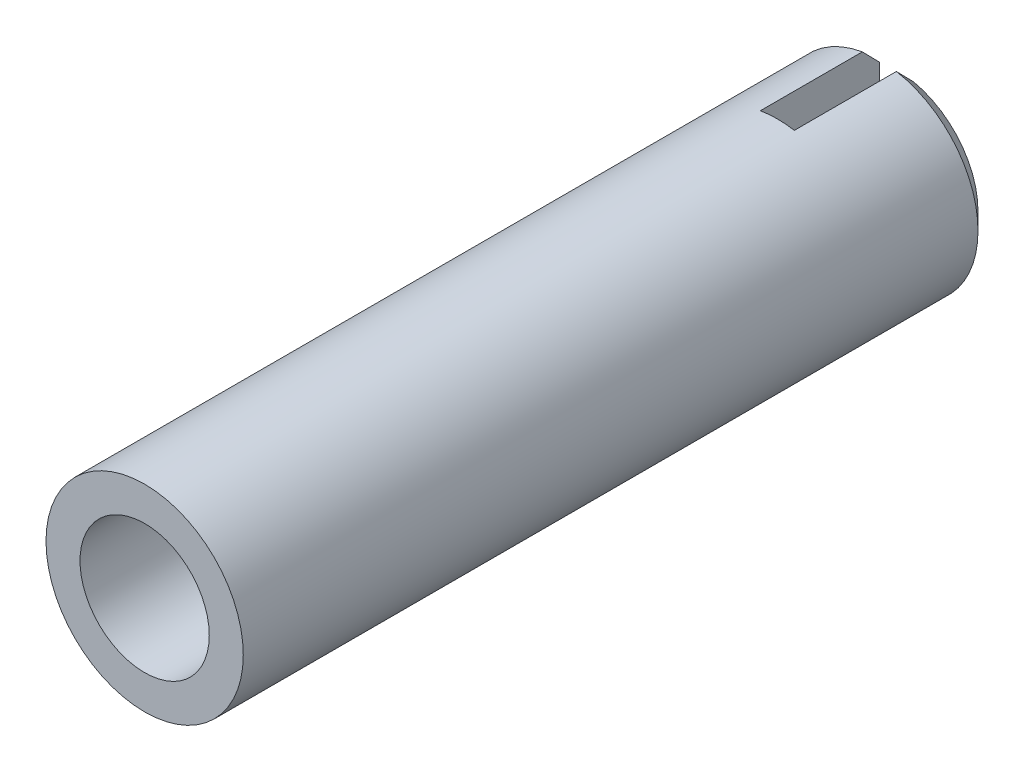
ISO-10303-21;
HEADER;
FILE_DESCRIPTION(('STEP AP214'),'2;1');
FILE_NAME('part.step','',(''),(''),'','','');
FILE_SCHEMA(('AUTOMOTIVE_DESIGN { 1 0 10303 214 1 1 1 1 }'));
ENDSEC;
DATA;
#1=APPLICATION_CONTEXT('core data for automotive mechanical design processes');
#2=APPLICATION_PROTOCOL_DEFINITION('international standard','automotive_design',2000,#1);
#3=PRODUCT_CONTEXT('',#1,'mechanical');
#4=PRODUCT('Part','Part','',(#3));
#5=PRODUCT_RELATED_PRODUCT_CATEGORY('part','',(#4));
#6=PRODUCT_DEFINITION_FORMATION('','',#4);
#7=PRODUCT_DEFINITION_CONTEXT('part definition',#1,'design');
#8=PRODUCT_DEFINITION('design','',#6,#7);
#9=PRODUCT_DEFINITION_SHAPE('','',#8);
#10=(LENGTH_UNIT() NAMED_UNIT(*) SI_UNIT(.MILLI.,.METRE.));
#11=(NAMED_UNIT(*) PLANE_ANGLE_UNIT() SI_UNIT($,.RADIAN.));
#12=(NAMED_UNIT(*) SI_UNIT($,.STERADIAN.) SOLID_ANGLE_UNIT());
#13=UNCERTAINTY_MEASURE_WITH_UNIT(LENGTH_MEASURE(1.E-05),#10,'distance_accuracy_value','');
#14=(GEOMETRIC_REPRESENTATION_CONTEXT(3) GLOBAL_UNCERTAINTY_ASSIGNED_CONTEXT((#13)) GLOBAL_UNIT_ASSIGNED_CONTEXT((#10,
#11,#12)) REPRESENTATION_CONTEXT('',''));
#15=CARTESIAN_POINT('',(0.,0.,0.));
#16=DIRECTION('',(0.,0.,1.));
#17=DIRECTION('',(1.,0.,0.));
#18=AXIS2_PLACEMENT_3D('',#15,#16,#17);
#19=CARTESIAN_POINT('',(0.,0.,-22.1));
#20=DIRECTION('',(0.,0.,1.));
#21=DIRECTION('',(1.,0.,0.));
#22=AXIS2_PLACEMENT_3D('',#19,#20,#21);
#23=PLANE('',#22);
#24=CARTESIAN_POINT('',(0.,0.,-22.1));
#25=DIRECTION('',(0.,0.,1.));
#26=DIRECTION('',(1.,0.,0.));
#27=AXIS2_PLACEMENT_3D('',#24,#25,#26);
#28=CIRCLE('',#27,1.9);
#29=CARTESIAN_POINT('',(0.50000000000001,-1.83303027798233,-22.1));
#30=VERTEX_POINT('',#29);
#31=CARTESIAN_POINT('',(0.500000000000011,1.83303027798233,-22.1));
#32=VERTEX_POINT('',#31);
#33=EDGE_CURVE('E207',#30,#32,#28,.T.);
#34=ORIENTED_EDGE('',*,*,#33,.T.);
#35=DIRECTION('',(0.,-1.,0.));
#36=VECTOR('',#35,1.);
#37=CARTESIAN_POINT('',(0.500000000000011,3.26536049666745,-22.1));
#38=LINE('',#37,#36);
#39=CARTESIAN_POINT('',(0.500000000000011,2.3473389188611,-22.1));
#40=VERTEX_POINT('',#39);
#41=EDGE_CURVE('E149',#40,#32,#38,.T.);
#42=ORIENTED_EDGE('',*,*,#41,.F.);
#43=CARTESIAN_POINT('',(0.,0.,-22.1));
#44=DIRECTION('',(0.,0.,1.));
#45=DIRECTION('',(1.,0.,0.));
#46=AXIS2_PLACEMENT_3D('',#43,#44,#45);
#47=CIRCLE('',#46,2.4);
#48=CARTESIAN_POINT('',(0.50000000000001,-2.3473389188611,-22.1));
#49=VERTEX_POINT('',#48);
#50=EDGE_CURVE('E151',#40,#49,#47,.F.);
#51=ORIENTED_EDGE('',*,*,#50,.T.);
#52=DIRECTION('',(0.,-1.,0.));
#53=VECTOR('',#52,1.);
#54=CARTESIAN_POINT('',(0.50000000000001,-3.26536049666745,-22.1));
#55=LINE('',#54,#53);
#56=EDGE_CURVE('E74',#30,#49,#55,.T.);
#57=ORIENTED_EDGE('',*,*,#56,.F.);
#58=EDGE_LOOP('',(#34,#42,#51,#57));
#59=FACE_BOUND('',#58,.T.);
#60=ADVANCED_FACE('F49',(#59),#23,.F.);
#61=CARTESIAN_POINT('',(0.,0.,-21.6));
#62=DIRECTION('',(0.,0.,1.));
#63=DIRECTION('',(1.,0.,0.));
#64=AXIS2_PLACEMENT_3D('',#61,#62,#63);
#65=CONICAL_SURFACE('',#64,2.9,0.785398163397458);
#66=CARTESIAN_POINT('',(0.500000000000011,4.56722580032637,-19.9054868036791));
#67=CARTESIAN_POINT('',(0.500000000000011,4.40086103835512,-20.0708535886335));
#68=CARTESIAN_POINT('',(0.500000000000011,4.23445195317437,-20.2361759196641));
#69=CARTESIAN_POINT('',(0.500000000000011,3.90149622107913,-20.5666506228982));
#70=CARTESIAN_POINT('',(0.500000000000011,3.73494958858814,-20.7318030096354));
#71=CARTESIAN_POINT('',(0.500000000000011,3.40168975670906,-21.0618372198682));
#72=CARTESIAN_POINT('',(0.500000000000011,3.23497662422342,-21.2267191109052));
#73=CARTESIAN_POINT('',(0.500000000000011,2.90119767581861,-21.5561565520699));
#74=CARTESIAN_POINT('',(0.500000000000011,2.73413182894792,-21.7207120708721));
#75=CARTESIAN_POINT('',(0.500000000000011,2.48305127699384,-21.967157203217));
#76=CARTESIAN_POINT('',(0.500000000000011,2.39925173843473,-22.04926596315));
#77=CARTESIAN_POINT('',(0.500000000000011,2.23145794918944,-22.2132798459408));
#78=CARTESIAN_POINT('',(0.500000000000011,2.14746370380979,-22.2951849742252));
#79=CARTESIAN_POINT('',(0.500000000000011,1.97922381124209,-22.4586932838065));
#80=CARTESIAN_POINT('',(0.500000000000011,1.8949782347399,-22.5402965377591));
#81=CARTESIAN_POINT('',(0.500000000000011,1.72608177565987,-22.7030991983488));
#82=CARTESIAN_POINT('',(0.500000000000011,1.64143085457795,-22.7842985650641));
#83=CARTESIAN_POINT('',(0.500000000000011,1.47145256519181,-22.9461382889178));
#84=CARTESIAN_POINT('',(0.500000000000011,1.38612466918012,-23.0267780939221));
#85=CARTESIAN_POINT('',(0.500000000000011,1.25739680638244,-23.1469241682626));
#86=CARTESIAN_POINT('',(0.500000000000011,1.21437136383943,-23.1868313237525));
#87=CARTESIAN_POINT('',(0.500000000000011,1.12798215259629,-23.2662843059874));
#88=CARTESIAN_POINT('',(0.500000000000011,1.08461836079116,-23.3058301076489));
#89=CARTESIAN_POINT('',(0.500000000000011,0.997385850604401,-23.3844639513819));
#90=CARTESIAN_POINT('',(0.500000000000011,0.953516608915167,-23.4235514147433));
#91=CARTESIAN_POINT('',(0.500000000000011,0.865145416125964,-23.5009892257541));
#92=CARTESIAN_POINT('',(0.500000000000011,0.820643586890463,-23.5393397121178));
#93=CARTESIAN_POINT('',(0.500000000000011,0.730658589761021,-23.6149792669702));
#94=CARTESIAN_POINT('',(0.500000000000011,0.685174456796516,-23.6522671995846));
#95=CARTESIAN_POINT('',(0.500000000000011,0.615859894005633,-23.7068532994026));
#96=CARTESIAN_POINT('',(0.500000000000011,0.592566000817788,-23.7248299151379));
#97=CARTESIAN_POINT('',(0.500000000000011,0.545511044110777,-23.7601719461194));
#98=CARTESIAN_POINT('',(0.500000000000011,0.521749865788445,-23.7775372081682));
#99=CARTESIAN_POINT('',(0.500000000000011,0.497706369424147,-23.7945131963209));
#100=B_SPLINE_CURVE_WITH_KNOTS('',3,(#66,#67,#68,#69,#70,#71,#72,#73,#74,#75,#76,#77,#78,#79,
#80,#81,#82,#83,#84,#85,#86,#87,#88,#89,#90,#91,#92,#93,#94,#95,#96,#97,#98,#99),.UNSPECIFIED.,
.F.,.F.,(4,2,2,2,2,2,2,2,2,2,2,2,2,2,2,2,4),(0.,0.703712208710922,1.40735817552992,
2.11078794100939,2.81428223793532,3.16624491926415,3.51819811844304,3.87006023531966,
4.22195646659375,4.57416102479055,4.75021044937648,4.92627200302129,5.10253602339399,
5.27876653568803,5.45517886330469,5.54344165659892,5.63172641221677),.UNSPECIFIED.);
#101=CARTESIAN_POINT('',(0.500000000000011,2.85657137141714,-21.6));
#102=VERTEX_POINT('',#101);
#103=EDGE_CURVE('E269',#102,#40,#100,.T.);
#104=ORIENTED_EDGE('',*,*,#103,.F.);
#105=CARTESIAN_POINT('',(0.,0.,-21.6));
#106=DIRECTION('',(0.,0.,1.));
#107=DIRECTION('',(1.,0.,0.));
#108=AXIS2_PLACEMENT_3D('',#105,#106,#107);
#109=CIRCLE('',#108,2.9);
#110=CARTESIAN_POINT('',(0.50000000000001,-2.85657137141714,-21.6));
#111=VERTEX_POINT('',#110);
#112=EDGE_CURVE('E157',#111,#102,#109,.T.);
#113=ORIENTED_EDGE('',*,*,#112,.F.);
#114=CARTESIAN_POINT('',(0.50000000000001,-0.497706369424139,-23.7945131963209));
#115=CARTESIAN_POINT('',(0.50000000000001,-0.52599163831723,-23.7745304111347));
#116=CARTESIAN_POINT('',(0.50000000000001,-0.553893059040027,-23.7540211707483));
#117=CARTESIAN_POINT('',(0.50000000000001,-0.609072205970474,-23.7121965079509));
#118=CARTESIAN_POINT('',(0.50000000000001,-0.636350135416068,-23.6908813544326));
#119=CARTESIAN_POINT('',(0.50000000000001,-0.690422117616199,-23.6476961811669));
#120=CARTESIAN_POINT('',(0.50000000000001,-0.717216557136705,-23.6258266419495));
#121=CARTESIAN_POINT('',(0.50000000000001,-0.770445986917643,-23.581650040367));
#122=CARTESIAN_POINT('',(0.50000000000001,-0.79688094262483,-23.5593429364398));
#123=CARTESIAN_POINT('',(0.50000000000001,-0.875707583654898,-23.4919751931768));
#124=CARTESIAN_POINT('',(0.50000000000001,-0.927677710608251,-23.4464220967916));
#125=CARTESIAN_POINT('',(0.50000000000001,-1.0308970454738,-23.3544837554955));
#126=CARTESIAN_POINT('',(0.50000000000001,-1.08214605136239,-23.3080982853603));
#127=CARTESIAN_POINT('',(0.50000000000001,-1.23477610455249,-23.1684750501359));
#128=CARTESIAN_POINT('',(0.50000000000001,-1.33542228703691,-23.0744354829964));
#129=CARTESIAN_POINT('',(0.50000000000001,-1.53569819522848,-22.8852795267836));
#130=CARTESIAN_POINT('',(0.50000000000001,-1.63532787326572,-22.7901630876468));
#131=CARTESIAN_POINT('',(0.50000000000001,-1.83397039306146,-22.5992925682383));
#132=CARTESIAN_POINT('',(0.50000000000001,-1.93298324804286,-22.5035385017271));
#133=CARTESIAN_POINT('',(0.50000000000001,-2.13061415393263,-22.3116289036643));
#134=CARTESIAN_POINT('',(0.50000000000001,-2.22923221341645,-22.2154733809265));
#135=CARTESIAN_POINT('',(0.50000000000001,-2.52493713991544,-21.9263718552832));
#136=CARTESIAN_POINT('',(0.50000000000001,-2.72163230272518,-21.7330253818188));
#137=CARTESIAN_POINT('',(0.50000000000001,-3.11448812378032,-21.3458006105996));
#138=CARTESIAN_POINT('',(0.50000000000001,-3.31064879458856,-21.1519223255635));
#139=CARTESIAN_POINT('',(0.50000000000001,-3.59517050732349,-20.8702482583632));
#140=CARTESIAN_POINT('',(0.50000000000001,-3.68365855062585,-20.7825807621648));
#141=CARTESIAN_POINT('',(0.50000000000001,-3.86058191562407,-20.6071916320026));
#142=CARTESIAN_POINT('',(0.50000000000001,-3.94901723703092,-20.5194699977474));
#143=CARTESIAN_POINT('',(0.50000000000001,-4.1257687972236,-20.3440584390401));
#144=CARTESIAN_POINT('',(0.50000000000001,-4.2140850730837,-20.2563685519429));
#145=CARTESIAN_POINT('',(0.50000000000001,-4.39068101051773,-20.0809529157863));
#146=CARTESIAN_POINT('',(0.50000000000001,-4.47896067229609,-19.9932271669326));
#147=CARTESIAN_POINT('',(0.50000000000001,-4.56722580032637,-19.9054868036791));
#148=B_SPLINE_CURVE_WITH_KNOTS('',3,(#114,#115,#116,#117,#118,#119,#120,#121,#122,#123,#124,
#125,#126,#127,#128,#129,#130,#131,#132,#133,#134,#135,#136,#137,#138,#139,#140,#141,#142,#143,
#144,#145,#146,#147),.UNSPECIFIED.,.F.,.F.,(4,2,2,2,2,2,2,2,2,2,2,2,2,2,2,2,4),(0.,
0.103875631204322,0.207716904981804,0.311471057131955,0.415235112529648,0.622544286590499,
0.829910426588166,1.2431186523347,1.65634616760963,2.06956479379518,2.48277439511077,
3.3102054632717,4.13761691254397,4.51130326531437,4.88499164797406,5.25835945516548,
5.63172514887428),.UNSPECIFIED.);
#149=EDGE_CURVE('E140',#49,#111,#148,.T.);
#150=ORIENTED_EDGE('',*,*,#149,.F.);
#151=ORIENTED_EDGE('',*,*,#50,.F.);
#152=EDGE_LOOP('',(#104,#113,#150,#151));
#153=FACE_BOUND('',#152,.T.);
#154=ADVANCED_FACE('F192',(#153),#65,.T.);
#155=CARTESIAN_POINT('',(0.,0.,-22.1));
#156=DIRECTION('',(0.,0.,1.));
#157=DIRECTION('',(1.,0.,0.));
#158=AXIS2_PLACEMENT_3D('',#155,#156,#157);
#159=CYLINDRICAL_SURFACE('',#158,2.9);
#160=DIRECTION('',(0.,0.,1.));
#161=VECTOR('',#160,1.);
#162=CARTESIAN_POINT('',(0.500000000000011,2.85657137141714,-22.1));
#163=LINE('',#162,#161);
#164=CARTESIAN_POINT('',(0.500000000000011,2.85657137141714,-18.6));
#165=VERTEX_POINT('',#164);
#166=EDGE_CURVE('E235',#165,#102,#163,.F.);
#167=ORIENTED_EDGE('',*,*,#166,.F.);
#168=CARTESIAN_POINT('',(0.,0.,-18.6));
#169=DIRECTION('',(0.,0.,1.));
#170=DIRECTION('',(1.,0.,0.));
#171=AXIS2_PLACEMENT_3D('',#168,#169,#170);
#172=CIRCLE('',#171,2.9);
#173=CARTESIAN_POINT('',(-0.499999999999989,2.85657137141714,-18.6));
#174=VERTEX_POINT('',#173);
#175=EDGE_CURVE('E215',#174,#165,#172,.F.);
#176=ORIENTED_EDGE('',*,*,#175,.F.);
#177=DIRECTION('',(0.,0.,1.));
#178=VECTOR('',#177,1.);
#179=CARTESIAN_POINT('',(-0.499999999999989,2.85657137141714,-22.1));
#180=LINE('',#179,#178);
#181=CARTESIAN_POINT('',(-0.499999999999989,2.85657137141714,-21.6));
#182=VERTEX_POINT('',#181);
#183=EDGE_CURVE('E228',#182,#174,#180,.T.);
#184=ORIENTED_EDGE('',*,*,#183,.F.);
#185=CARTESIAN_POINT('',(-0.49999999999999,-2.85657137141714,-21.6));
#186=VERTEX_POINT('',#185);
#187=EDGE_CURVE('E155',#182,#186,#109,.T.);
#188=ORIENTED_EDGE('',*,*,#187,.T.);
#189=DIRECTION('',(0.,0.,1.));
#190=VECTOR('',#189,1.);
#191=CARTESIAN_POINT('',(-0.49999999999999,-2.85657137141714,-22.1));
#192=LINE('',#191,#190);
#193=CARTESIAN_POINT('',(-0.49999999999999,-2.85657137141714,-18.6));
#194=VERTEX_POINT('',#193);
#195=EDGE_CURVE('E134',#194,#186,#192,.F.);
#196=ORIENTED_EDGE('',*,*,#195,.F.);
#197=CARTESIAN_POINT('',(0.,0.,-18.6));
#198=DIRECTION('',(0.,0.,-1.));
#199=DIRECTION('',(-1.,0.,0.));
#200=AXIS2_PLACEMENT_3D('',#197,#198,#199);
#201=CIRCLE('',#200,2.9);
#202=CARTESIAN_POINT('',(0.50000000000001,-2.85657137141714,-18.6));
#203=VERTEX_POINT('',#202);
#204=EDGE_CURVE('E242',#194,#203,#201,.F.);
#205=ORIENTED_EDGE('',*,*,#204,.T.);
#206=DIRECTION('',(0.,0.,1.));
#207=VECTOR('',#206,1.);
#208=CARTESIAN_POINT('',(0.50000000000001,-2.85657137141714,-22.1));
#209=LINE('',#208,#207);
#210=EDGE_CURVE('E252',#111,#203,#209,.T.);
#211=ORIENTED_EDGE('',*,*,#210,.F.);
#212=ORIENTED_EDGE('',*,*,#112,.T.);
#213=EDGE_LOOP('',(#167,#176,#184,#188,#196,#205,#211,#212));
#214=FACE_BOUND('',#213,.T.);
#215=CARTESIAN_POINT('',(0.,0.,0.));
#216=DIRECTION('',(0.,0.,1.));
#217=DIRECTION('',(1.,0.,0.));
#218=AXIS2_PLACEMENT_3D('',#215,#216,#217);
#219=CIRCLE('',#218,2.9);
#220=CARTESIAN_POINT('',(2.9,0.,0.));
#221=VERTEX_POINT('',#220);
#222=EDGE_CURVE('E213',#221,#221,#219,.T.);
#223=ORIENTED_EDGE('',*,*,#222,.F.);
#224=EDGE_LOOP('',(#223));
#225=FACE_BOUND('',#224,.T.);
#226=ADVANCED_FACE('F188',(#214,#225),#159,.T.);
#227=CARTESIAN_POINT('',(-0.49999999999999,-2.3473389188611,-22.1));
#228=VERTEX_POINT('',#227);
#229=CARTESIAN_POINT('',(-0.499999999999989,2.3473389188611,-22.1));
#230=VERTEX_POINT('',#229);
#231=EDGE_CURVE('E146',#228,#230,#47,.F.);
#232=ORIENTED_EDGE('',*,*,#231,.T.);
#233=DIRECTION('',(0.,1.,0.));
#234=VECTOR('',#233,1.);
#235=CARTESIAN_POINT('',(-0.499999999999989,3.26536049666745,-22.1));
#236=LINE('',#235,#234);
#237=CARTESIAN_POINT('',(-0.499999999999989,1.83303027798234,-22.1));
#238=VERTEX_POINT('',#237);
#239=EDGE_CURVE('E66',#238,#230,#236,.T.);
#240=ORIENTED_EDGE('',*,*,#239,.F.);
#241=CARTESIAN_POINT('',(-0.49999999999999,-1.83303027798234,-22.1));
#242=VERTEX_POINT('',#241);
#243=EDGE_CURVE('E148',#238,#242,#28,.T.);
#244=ORIENTED_EDGE('',*,*,#243,.T.);
#245=DIRECTION('',(0.,1.,0.));
#246=VECTOR('',#245,1.);
#247=CARTESIAN_POINT('',(-0.49999999999999,-3.26536049666745,-22.1));
#248=LINE('',#247,#246);
#249=EDGE_CURVE('E131',#228,#242,#248,.T.);
#250=ORIENTED_EDGE('',*,*,#249,.F.);
#251=EDGE_LOOP('',(#232,#240,#244,#250));
#252=FACE_BOUND('',#251,.T.);
#253=ADVANCED_FACE('F145',(#252),#23,.F.);
#254=CARTESIAN_POINT('',(0.,0.,0.));
#255=DIRECTION('',(0.,0.,1.));
#256=DIRECTION('',(1.,0.,0.));
#257=AXIS2_PLACEMENT_3D('',#254,#255,#256);
#258=PLANE('',#257);
#259=CARTESIAN_POINT('',(0.,0.,0.));
#260=DIRECTION('',(0.,0.,1.));
#261=DIRECTION('',(1.,0.,0.));
#262=AXIS2_PLACEMENT_3D('',#259,#260,#261);
#263=CIRCLE('',#262,1.9);
#264=CARTESIAN_POINT('',(1.9,0.,0.));
#265=VERTEX_POINT('',#264);
#266=EDGE_CURVE('E211',#265,#265,#263,.T.);
#267=ORIENTED_EDGE('',*,*,#266,.F.);
#268=EDGE_LOOP('',(#267));
#269=FACE_BOUND('',#268,.T.);
#270=ORIENTED_EDGE('',*,*,#222,.T.);
#271=EDGE_LOOP('',(#270));
#272=FACE_BOUND('',#271,.T.);
#273=ADVANCED_FACE('F184',(#269,#272),#258,.T.);
#274=CARTESIAN_POINT('',(0.,0.,-22.1));
#275=DIRECTION('',(0.,0.,1.));
#276=DIRECTION('',(1.,0.,0.));
#277=AXIS2_PLACEMENT_3D('',#274,#275,#276);
#278=CYLINDRICAL_SURFACE('',#277,1.9);
#279=CARTESIAN_POINT('',(0.,0.,-18.6));
#280=DIRECTION('',(0.,0.,1.));
#281=DIRECTION('',(1.,0.,0.));
#282=AXIS2_PLACEMENT_3D('',#279,#280,#281);
#283=CIRCLE('',#282,1.9);
#284=CARTESIAN_POINT('',(-0.499999999999989,1.83303027798234,-18.6));
#285=VERTEX_POINT('',#284);
#286=CARTESIAN_POINT('',(0.500000000000011,1.83303027798233,-18.6));
#287=VERTEX_POINT('',#286);
#288=EDGE_CURVE('E12',#285,#287,#283,.F.);
#289=ORIENTED_EDGE('',*,*,#288,.T.);
#290=DIRECTION('',(0.,0.,1.));
#291=VECTOR('',#290,1.);
#292=CARTESIAN_POINT('',(0.500000000000011,1.83303027798233,-22.1));
#293=LINE('',#292,#291);
#294=EDGE_CURVE('E241',#287,#32,#293,.F.);
#295=ORIENTED_EDGE('',*,*,#294,.T.);
#296=ORIENTED_EDGE('',*,*,#33,.F.);
#297=DIRECTION('',(0.,0.,1.));
#298=VECTOR('',#297,1.);
#299=CARTESIAN_POINT('',(0.50000000000001,-1.83303027798233,-22.1));
#300=LINE('',#299,#298);
#301=CARTESIAN_POINT('',(0.50000000000001,-1.83303027798233,-18.6));
#302=VERTEX_POINT('',#301);
#303=EDGE_CURVE('E265',#30,#302,#300,.T.);
#304=ORIENTED_EDGE('',*,*,#303,.T.);
#305=CARTESIAN_POINT('',(0.,0.,-18.6));
#306=DIRECTION('',(0.,0.,-1.));
#307=DIRECTION('',(-1.,0.,0.));
#308=AXIS2_PLACEMENT_3D('',#305,#306,#307);
#309=CIRCLE('',#308,1.9);
#310=CARTESIAN_POINT('',(-0.49999999999999,-1.83303027798234,-18.6));
#311=VERTEX_POINT('',#310);
#312=EDGE_CURVE('E59',#311,#302,#309,.F.);
#313=ORIENTED_EDGE('',*,*,#312,.F.);
#314=DIRECTION('',(0.,0.,1.));
#315=VECTOR('',#314,1.);
#316=CARTESIAN_POINT('',(-0.49999999999999,-1.83303027798234,-22.1));
#317=LINE('',#316,#315);
#318=EDGE_CURVE('E232',#311,#242,#317,.F.);
#319=ORIENTED_EDGE('',*,*,#318,.T.);
#320=ORIENTED_EDGE('',*,*,#243,.F.);
#321=DIRECTION('',(0.,0.,1.));
#322=VECTOR('',#321,1.);
#323=CARTESIAN_POINT('',(-0.499999999999989,1.83303027798234,-22.1));
#324=LINE('',#323,#322);
#325=EDGE_CURVE('E231',#238,#285,#324,.T.);
#326=ORIENTED_EDGE('',*,*,#325,.T.);
#327=EDGE_LOOP('',(#289,#295,#296,#304,#313,#319,#320,#326));
#328=FACE_BOUND('',#327,.T.);
#329=ORIENTED_EDGE('',*,*,#266,.T.);
#330=EDGE_LOOP('',(#329));
#331=FACE_BOUND('',#330,.T.);
#332=ADVANCED_FACE('F181',(#328,#331),#278,.F.);
#333=CARTESIAN_POINT('',(-0.49999999999999,0.497706369424167,-23.7945131963209));
#334=CARTESIAN_POINT('',(-0.49999999999999,0.525991638317258,-23.7745304111347));
#335=CARTESIAN_POINT('',(-0.49999999999999,0.553893059040054,-23.7540211707483));
#336=CARTESIAN_POINT('',(-0.49999999999999,0.609072205970501,-23.7121965079509));
#337=CARTESIAN_POINT('',(-0.49999999999999,0.636350135416095,-23.6908813544326));
#338=CARTESIAN_POINT('',(-0.49999999999999,0.690422117616225,-23.6476961811669));
#339=CARTESIAN_POINT('',(-0.49999999999999,0.71721655713673,-23.6258266419495));
#340=CARTESIAN_POINT('',(-0.49999999999999,0.770445986917668,-23.581650040367));
#341=CARTESIAN_POINT('',(-0.49999999999999,0.796880942624856,-23.5593429364398));
#342=CARTESIAN_POINT('',(-0.49999999999999,0.875707583654923,-23.4919751931768));
#343=CARTESIAN_POINT('',(-0.499999999999989,0.927677710608276,-23.4464220967916));
#344=CARTESIAN_POINT('',(-0.499999999999989,1.03089704547382,-23.3544837554954));
#345=CARTESIAN_POINT('',(-0.499999999999989,1.08214605136242,-23.3080982853603));
#346=CARTESIAN_POINT('',(-0.499999999999989,1.23477610455252,-23.1684750501359));
#347=CARTESIAN_POINT('',(-0.499999999999989,1.33542228703693,-23.0744354829964));
#348=CARTESIAN_POINT('',(-0.499999999999989,1.53569819522851,-22.8852795267836));
#349=CARTESIAN_POINT('',(-0.499999999999989,1.63532787326575,-22.7901630876468));
#350=CARTESIAN_POINT('',(-0.499999999999989,1.8339703930615,-22.5992925682382));
#351=CARTESIAN_POINT('',(-0.499999999999989,1.9329832480429,-22.5035385017271));
#352=CARTESIAN_POINT('',(-0.499999999999989,2.13061415393266,-22.3116289036643));
#353=CARTESIAN_POINT('',(-0.499999999999989,2.22923221341649,-22.2154733809265));
#354=CARTESIAN_POINT('',(-0.499999999999989,2.52493713991548,-21.9263718552832));
#355=CARTESIAN_POINT('',(-0.499999999999989,2.72163230272522,-21.7330253818187));
#356=CARTESIAN_POINT('',(-0.499999999999989,3.11448812378036,-21.3458006105996));
#357=CARTESIAN_POINT('',(-0.499999999999989,3.31064879458861,-21.1519223255635));
#358=CARTESIAN_POINT('',(-0.499999999999989,3.59517050732353,-20.8702482583632));
#359=CARTESIAN_POINT('',(-0.499999999999989,3.68365855062589,-20.7825807621647));
#360=CARTESIAN_POINT('',(-0.499999999999989,3.8605819156241,-20.6071916320026));
#361=CARTESIAN_POINT('',(-0.499999999999989,3.94901723703095,-20.5194699977473));
#362=CARTESIAN_POINT('',(-0.499999999999989,4.12576879722362,-20.3440584390401));
#363=CARTESIAN_POINT('',(-0.499999999999989,4.21408507308372,-20.2563685519429));
#364=CARTESIAN_POINT('',(-0.499999999999989,4.39068101051774,-20.0809529157863));
#365=CARTESIAN_POINT('',(-0.499999999999989,4.4789606722961,-19.9932271669326));
#366=CARTESIAN_POINT('',(-0.499999999999989,4.56722580032637,-19.9054868036791));
#367=B_SPLINE_CURVE_WITH_KNOTS('',3,(#333,#334,#335,#336,#337,#338,#339,#340,#341,#342,#343,
#344,#345,#346,#347,#348,#349,#350,#351,#352,#353,#354,#355,#356,#357,#358,#359,#360,#361,#362,
#363,#364,#365,#366),.UNSPECIFIED.,.F.,.F.,(4,2,2,2,2,2,2,2,2,2,2,2,2,2,2,2,4),(0.,
0.103875631204321,0.207716904981805,0.311471057131955,0.415235112529649,0.622544286590498,
0.829910426588173,1.2431186523347,1.65634616760964,2.0695647937952,2.48277439511079,
3.31020546327173,4.13761691254401,4.5113032653144,4.88499164797406,5.25835945516547,
5.63172514887426),.UNSPECIFIED.);
#368=EDGE_CURVE('E139',#230,#182,#367,.T.);
#369=ORIENTED_EDGE('',*,*,#368,.F.);
#370=ORIENTED_EDGE('',*,*,#231,.F.);
#371=CARTESIAN_POINT('',(-0.49999999999999,-4.56722580032637,-19.9054868036791));
#372=CARTESIAN_POINT('',(-0.49999999999999,-4.40086103835513,-20.0708535886335));
#373=CARTESIAN_POINT('',(-0.49999999999999,-4.23445195317438,-20.2361759196641));
#374=CARTESIAN_POINT('',(-0.49999999999999,-3.90149622107914,-20.5666506228982));
#375=CARTESIAN_POINT('',(-0.49999999999999,-3.73494958858815,-20.7318030096354));
#376=CARTESIAN_POINT('',(-0.49999999999999,-3.40168975670907,-21.0618372198682));
#377=CARTESIAN_POINT('',(-0.49999999999999,-3.23497662422343,-21.2267191109052));
#378=CARTESIAN_POINT('',(-0.49999999999999,-2.90119767581862,-21.5561565520699));
#379=CARTESIAN_POINT('',(-0.49999999999999,-2.73413182894793,-21.7207120708721));
#380=CARTESIAN_POINT('',(-0.49999999999999,-2.48305127699385,-21.967157203217));
#381=CARTESIAN_POINT('',(-0.49999999999999,-2.39925173843474,-22.04926596315));
#382=CARTESIAN_POINT('',(-0.49999999999999,-2.23145794918946,-22.2132798459408));
#383=CARTESIAN_POINT('',(-0.49999999999999,-2.1474637038098,-22.2951849742252));
#384=CARTESIAN_POINT('',(-0.49999999999999,-1.97922381124211,-22.4586932838064));
#385=CARTESIAN_POINT('',(-0.49999999999999,-1.89497823473991,-22.5402965377591));
#386=CARTESIAN_POINT('',(-0.49999999999999,-1.72608177565988,-22.7030991983487));
#387=CARTESIAN_POINT('',(-0.49999999999999,-1.64143085457797,-22.7842985650641));
#388=CARTESIAN_POINT('',(-0.49999999999999,-1.47145256519183,-22.9461382889178));
#389=CARTESIAN_POINT('',(-0.49999999999999,-1.38612466918014,-23.0267780939221));
#390=CARTESIAN_POINT('',(-0.49999999999999,-1.25739680638246,-23.1469241682626));
#391=CARTESIAN_POINT('',(-0.49999999999999,-1.21437136383944,-23.1868313237525));
#392=CARTESIAN_POINT('',(-0.49999999999999,-1.12798215259631,-23.2662843059874));
#393=CARTESIAN_POINT('',(-0.49999999999999,-1.08461836079118,-23.3058301076489));
#394=CARTESIAN_POINT('',(-0.49999999999999,-0.997385850604421,-23.3844639513819));
#395=CARTESIAN_POINT('',(-0.49999999999999,-0.953516608915187,-23.4235514147433));
#396=CARTESIAN_POINT('',(-0.49999999999999,-0.865145416125984,-23.500989225754));
#397=CARTESIAN_POINT('',(-0.49999999999999,-0.820643586890484,-23.5393397121178));
#398=CARTESIAN_POINT('',(-0.49999999999999,-0.730658589761044,-23.6149792669702));
#399=CARTESIAN_POINT('',(-0.49999999999999,-0.68517445679654,-23.6522671995846));
#400=CARTESIAN_POINT('',(-0.49999999999999,-0.615859894005659,-23.7068532994026));
#401=CARTESIAN_POINT('',(-0.49999999999999,-0.592566000817814,-23.7248299151379));
#402=CARTESIAN_POINT('',(-0.49999999999999,-0.545511044110805,-23.7601719461194));
#403=CARTESIAN_POINT('',(-0.49999999999999,-0.521749865788474,-23.7775372081682));
#404=CARTESIAN_POINT('',(-0.49999999999999,-0.497706369424177,-23.7945131963209));
#405=B_SPLINE_CURVE_WITH_KNOTS('',3,(#371,#372,#373,#374,#375,#376,#377,#378,#379,#380,#381,
#382,#383,#384,#385,#386,#387,#388,#389,#390,#391,#392,#393,#394,#395,#396,#397,#398,#399,#400,
#401,#402,#403,#404),.UNSPECIFIED.,.F.,.F.,(4,2,2,2,2,2,2,2,2,2,2,2,2,2,2,2,4),(0.,
0.703712208710921,1.40735817552992,2.11078794100938,2.81428223793531,3.16624491926414,
3.51819811844302,3.87006023531965,4.22195646659373,4.57416102479053,4.75021044937646,
4.92627200302127,5.10253602339397,5.27876653568801,5.45517886330467,5.5434416565989,
5.63172641221674),.UNSPECIFIED.);
#406=EDGE_CURVE('E127',#186,#228,#405,.T.);
#407=ORIENTED_EDGE('',*,*,#406,.F.);
#408=ORIENTED_EDGE('',*,*,#187,.F.);
#409=EDGE_LOOP('',(#369,#370,#407,#408));
#410=FACE_BOUND('',#409,.T.);
#411=ADVANCED_FACE('F52',(#410),#65,.T.);
#412=CARTESIAN_POINT('',(0.,0.,-18.6));
#413=DIRECTION('',(0.,0.,-1.));
#414=DIRECTION('',(-1.,0.,0.));
#415=AXIS2_PLACEMENT_3D('',#412,#413,#414);
#416=PLANE('',#415);
#417=DIRECTION('',(0.,1.,0.));
#418=VECTOR('',#417,1.);
#419=CARTESIAN_POINT('',(-0.49999999999999,-3.26536049666745,-18.6));
#420=LINE('',#419,#418);
#421=EDGE_CURVE('E257',#194,#311,#420,.T.);
#422=ORIENTED_EDGE('',*,*,#421,.T.);
#423=ORIENTED_EDGE('',*,*,#312,.T.);
#424=DIRECTION('',(0.,-1.,0.));
#425=VECTOR('',#424,1.);
#426=CARTESIAN_POINT('',(0.50000000000001,-3.26536049666745,-18.6));
#427=LINE('',#426,#425);
#428=EDGE_CURVE('E259',#302,#203,#427,.T.);
#429=ORIENTED_EDGE('',*,*,#428,.T.);
#430=ORIENTED_EDGE('',*,*,#204,.F.);
#431=EDGE_LOOP('',(#422,#423,#429,#430));
#432=FACE_BOUND('',#431,.T.);
#433=ADVANCED_FACE('F177',(#432),#416,.T.);
#434=CARTESIAN_POINT('',(-0.49999999999999,-3.26536049666745,-18.6));
#435=DIRECTION('',(-1.,0.,0.));
#436=DIRECTION('',(0.,-1.,0.));
#437=AXIS2_PLACEMENT_3D('',#434,#435,#436);
#438=PLANE('',#437);
#439=ORIENTED_EDGE('',*,*,#421,.F.);
#440=ORIENTED_EDGE('',*,*,#195,.T.);
#441=ORIENTED_EDGE('',*,*,#406,.T.);
#442=ORIENTED_EDGE('',*,*,#249,.T.);
#443=ORIENTED_EDGE('',*,*,#318,.F.);
#444=EDGE_LOOP('',(#439,#440,#441,#442,#443));
#445=FACE_BOUND('',#444,.T.);
#446=ADVANCED_FACE('F130',(#445),#438,.F.);
#447=CARTESIAN_POINT('',(0.50000000000001,-3.26536049666745,-18.6));
#448=DIRECTION('',(1.,0.,0.));
#449=DIRECTION('',(0.,1.,0.));
#450=AXIS2_PLACEMENT_3D('',#447,#448,#449);
#451=PLANE('',#450);
#452=ORIENTED_EDGE('',*,*,#56,.T.);
#453=ORIENTED_EDGE('',*,*,#149,.T.);
#454=ORIENTED_EDGE('',*,*,#210,.T.);
#455=ORIENTED_EDGE('',*,*,#428,.F.);
#456=ORIENTED_EDGE('',*,*,#303,.F.);
#457=EDGE_LOOP('',(#452,#453,#454,#455,#456));
#458=FACE_BOUND('',#457,.T.);
#459=ADVANCED_FACE('F170',(#458),#451,.F.);
#460=CARTESIAN_POINT('',(0.,0.,-18.6));
#461=DIRECTION('',(0.,0.,1.));
#462=DIRECTION('',(1.,0.,0.));
#463=AXIS2_PLACEMENT_3D('',#460,#461,#462);
#464=PLANE('',#463);
#465=ORIENTED_EDGE('',*,*,#175,.T.);
#466=DIRECTION('',(0.,-1.,0.));
#467=VECTOR('',#466,1.);
#468=CARTESIAN_POINT('',(0.500000000000011,3.26536049666745,-18.6));
#469=LINE('',#468,#467);
#470=EDGE_CURVE('E246',#165,#287,#469,.T.);
#471=ORIENTED_EDGE('',*,*,#470,.T.);
#472=ORIENTED_EDGE('',*,*,#288,.F.);
#473=DIRECTION('',(0.,1.,0.));
#474=VECTOR('',#473,1.);
#475=CARTESIAN_POINT('',(-0.499999999999989,3.26536049666745,-18.6));
#476=LINE('',#475,#474);
#477=EDGE_CURVE('E247',#285,#174,#476,.T.);
#478=ORIENTED_EDGE('',*,*,#477,.T.);
#479=EDGE_LOOP('',(#465,#471,#472,#478));
#480=FACE_BOUND('',#479,.T.);
#481=ADVANCED_FACE('F174',(#480),#464,.F.);
#482=CARTESIAN_POINT('',(0.500000000000011,3.26536049666745,-18.6));
#483=DIRECTION('',(1.,0.,0.));
#484=DIRECTION('',(0.,1.,0.));
#485=AXIS2_PLACEMENT_3D('',#482,#483,#484);
#486=PLANE('',#485);
#487=ORIENTED_EDGE('',*,*,#470,.F.);
#488=ORIENTED_EDGE('',*,*,#166,.T.);
#489=ORIENTED_EDGE('',*,*,#103,.T.);
#490=ORIENTED_EDGE('',*,*,#41,.T.);
#491=ORIENTED_EDGE('',*,*,#294,.F.);
#492=EDGE_LOOP('',(#487,#488,#489,#490,#491));
#493=FACE_BOUND('',#492,.T.);
#494=ADVANCED_FACE('F249',(#493),#486,.F.);
#495=CARTESIAN_POINT('',(-0.499999999999989,3.26536049666745,-18.6));
#496=DIRECTION('',(-1.,0.,0.));
#497=DIRECTION('',(0.,-1.,0.));
#498=AXIS2_PLACEMENT_3D('',#495,#496,#497);
#499=PLANE('',#498);
#500=ORIENTED_EDGE('',*,*,#239,.T.);
#501=ORIENTED_EDGE('',*,*,#368,.T.);
#502=ORIENTED_EDGE('',*,*,#183,.T.);
#503=ORIENTED_EDGE('',*,*,#477,.F.);
#504=ORIENTED_EDGE('',*,*,#325,.F.);
#505=EDGE_LOOP('',(#500,#501,#502,#503,#504));
#506=FACE_BOUND('',#505,.T.);
#507=ADVANCED_FACE('F282',(#506),#499,.F.);
#508=CLOSED_SHELL('',(#60,#154,#226,#253,#273,#332,#411,#433,#446,#459,#481,#494,#507));
#509=MANIFOLD_SOLID_BREP('B2',#508);
#510=ADVANCED_BREP_SHAPE_REPRESENTATION('',(#18,#509),#14);
#511=SHAPE_DEFINITION_REPRESENTATION(#9,#510);
ENDSEC;
END-ISO-10303-21;
